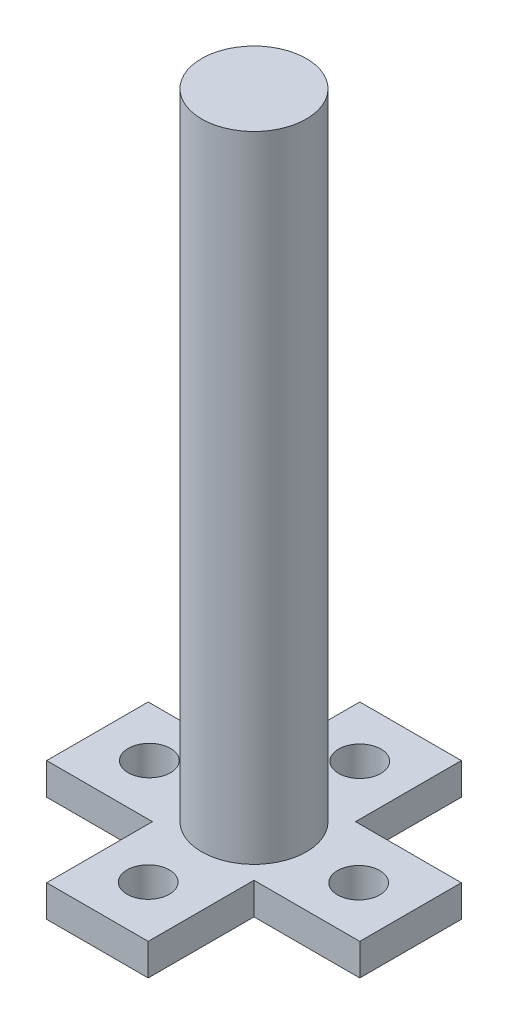
ISO-10303-21;
HEADER;
FILE_DESCRIPTION(('STEP AP214'),'2;1');
FILE_NAME('part.step','',(''),(''),'','','');
FILE_SCHEMA(('AUTOMOTIVE_DESIGN { 1 0 10303 214 1 1 1 1 }'));
ENDSEC;
DATA;
#1=APPLICATION_CONTEXT('core data for automotive mechanical design processes');
#2=APPLICATION_PROTOCOL_DEFINITION('international standard','automotive_design',2000,#1);
#3=PRODUCT_CONTEXT('',#1,'mechanical');
#4=PRODUCT('Part','Part','',(#3));
#5=PRODUCT_RELATED_PRODUCT_CATEGORY('part','',(#4));
#6=PRODUCT_DEFINITION_FORMATION('','',#4);
#7=PRODUCT_DEFINITION_CONTEXT('part definition',#1,'design');
#8=PRODUCT_DEFINITION('design','',#6,#7);
#9=PRODUCT_DEFINITION_SHAPE('','',#8);
#10=(LENGTH_UNIT() NAMED_UNIT(*) SI_UNIT(.MILLI.,.METRE.));
#11=(NAMED_UNIT(*) PLANE_ANGLE_UNIT() SI_UNIT($,.RADIAN.));
#12=(NAMED_UNIT(*) SI_UNIT($,.STERADIAN.) SOLID_ANGLE_UNIT());
#13=UNCERTAINTY_MEASURE_WITH_UNIT(LENGTH_MEASURE(1.E-05),#10,'distance_accuracy_value','');
#14=(GEOMETRIC_REPRESENTATION_CONTEXT(3) GLOBAL_UNCERTAINTY_ASSIGNED_CONTEXT((#13)) GLOBAL_UNIT_ASSIGNED_CONTEXT((#10,
#11,#12)) REPRESENTATION_CONTEXT('',''));
#15=CARTESIAN_POINT('',(0.,0.,0.));
#16=DIRECTION('',(0.,0.,1.));
#17=DIRECTION('',(1.,0.,0.));
#18=AXIS2_PLACEMENT_3D('',#15,#16,#17);
#19=CARTESIAN_POINT('',(-14.8,3.,0.));
#20=DIRECTION('',(-1.,0.,0.));
#21=DIRECTION('',(0.,0.,1.));
#22=AXIS2_PLACEMENT_3D('',#19,#20,#21);
#23=PLANE('',#22);
#24=DIRECTION('',(0.,0.,-1.));
#25=VECTOR('',#24,1.);
#26=CARTESIAN_POINT('',(-14.8,0.,0.));
#27=LINE('',#26,#25);
#28=CARTESIAN_POINT('',(-14.8,0.,4.8));
#29=VERTEX_POINT('',#28);
#30=CARTESIAN_POINT('',(-14.8,0.,-4.8));
#31=VERTEX_POINT('',#30);
#32=EDGE_CURVE('E189',#29,#31,#27,.T.);
#33=ORIENTED_EDGE('',*,*,#32,.F.);
#34=DIRECTION('',(0.,-1.,0.));
#35=VECTOR('',#34,1.);
#36=CARTESIAN_POINT('',(-14.8,3.,4.8));
#37=LINE('',#36,#35);
#38=CARTESIAN_POINT('',(-14.8,3.,4.8));
#39=VERTEX_POINT('',#38);
#40=EDGE_CURVE('E57',#39,#29,#37,.T.);
#41=ORIENTED_EDGE('',*,*,#40,.F.);
#42=DIRECTION('',(0.,0.,-1.));
#43=VECTOR('',#42,1.);
#44=CARTESIAN_POINT('',(-14.8,3.,0.));
#45=LINE('',#44,#43);
#46=CARTESIAN_POINT('',(-14.8,3.,-4.8));
#47=VERTEX_POINT('',#46);
#48=EDGE_CURVE('E365',#39,#47,#45,.T.);
#49=ORIENTED_EDGE('',*,*,#48,.T.);
#50=DIRECTION('',(0.,-1.,0.));
#51=VECTOR('',#50,1.);
#52=CARTESIAN_POINT('',(-14.8,3.,-4.8));
#53=LINE('',#52,#51);
#54=EDGE_CURVE('E65',#47,#31,#53,.T.);
#55=ORIENTED_EDGE('',*,*,#54,.T.);
#56=EDGE_LOOP('',(#33,#41,#49,#55));
#57=FACE_BOUND('',#56,.T.);
#58=ADVANCED_FACE('F47',(#57),#23,.T.);
#59=CARTESIAN_POINT('',(0.,3.,4.8));
#60=DIRECTION('',(0.,0.,-1.));
#61=DIRECTION('',(-1.,0.,0.));
#62=AXIS2_PLACEMENT_3D('',#59,#60,#61);
#63=PLANE('',#62);
#64=DIRECTION('',(1.,0.,0.));
#65=VECTOR('',#64,1.);
#66=CARTESIAN_POINT('',(0.,0.,4.8));
#67=LINE('',#66,#65);
#68=CARTESIAN_POINT('',(-4.80000000000001,0.,4.8));
#69=VERTEX_POINT('',#68);
#70=EDGE_CURVE('E193',#29,#69,#67,.T.);
#71=ORIENTED_EDGE('',*,*,#70,.T.);
#72=DIRECTION('',(0.,-1.,0.));
#73=VECTOR('',#72,1.);
#74=CARTESIAN_POINT('',(-4.80000000000001,3.,4.8));
#75=LINE('',#74,#73);
#76=CARTESIAN_POINT('',(-4.80000000000001,3.,4.8));
#77=VERTEX_POINT('',#76);
#78=EDGE_CURVE('E274',#77,#69,#75,.T.);
#79=ORIENTED_EDGE('',*,*,#78,.F.);
#80=DIRECTION('',(1.,0.,0.));
#81=VECTOR('',#80,1.);
#82=CARTESIAN_POINT('',(0.,3.,4.8));
#83=LINE('',#82,#81);
#84=EDGE_CURVE('E281',#39,#77,#83,.T.);
#85=ORIENTED_EDGE('',*,*,#84,.F.);
#86=ORIENTED_EDGE('',*,*,#40,.T.);
#87=EDGE_LOOP('',(#71,#79,#85,#86));
#88=FACE_BOUND('',#87,.T.);
#89=ADVANCED_FACE('F279',(#88),#63,.F.);
#90=CARTESIAN_POINT('',(-4.80000000000001,3.,0.));
#91=DIRECTION('',(-1.,0.,0.));
#92=DIRECTION('',(0.,0.,1.));
#93=AXIS2_PLACEMENT_3D('',#90,#91,#92);
#94=PLANE('',#93);
#95=DIRECTION('',(0.,0.,-1.));
#96=VECTOR('',#95,1.);
#97=CARTESIAN_POINT('',(-4.80000000000001,0.,0.));
#98=LINE('',#97,#96);
#99=CARTESIAN_POINT('',(-4.80000000000001,0.,14.8));
#100=VERTEX_POINT('',#99);
#101=EDGE_CURVE('E197',#100,#69,#98,.T.);
#102=ORIENTED_EDGE('',*,*,#101,.F.);
#103=DIRECTION('',(0.,-1.,0.));
#104=VECTOR('',#103,1.);
#105=CARTESIAN_POINT('',(-4.80000000000001,3.,14.8));
#106=LINE('',#105,#104);
#107=CARTESIAN_POINT('',(-4.80000000000001,3.,14.8));
#108=VERTEX_POINT('',#107);
#109=EDGE_CURVE('E271',#108,#100,#106,.T.);
#110=ORIENTED_EDGE('',*,*,#109,.F.);
#111=DIRECTION('',(0.,0.,-1.));
#112=VECTOR('',#111,1.);
#113=CARTESIAN_POINT('',(-4.80000000000001,3.,0.));
#114=LINE('',#113,#112);
#115=EDGE_CURVE('E370',#108,#77,#114,.T.);
#116=ORIENTED_EDGE('',*,*,#115,.T.);
#117=ORIENTED_EDGE('',*,*,#78,.T.);
#118=EDGE_LOOP('',(#102,#110,#116,#117));
#119=FACE_BOUND('',#118,.T.);
#120=ADVANCED_FACE('F291',(#119),#94,.T.);
#121=CARTESIAN_POINT('',(0.,3.,14.8));
#122=DIRECTION('',(0.,0.,-1.));
#123=DIRECTION('',(-1.,0.,0.));
#124=AXIS2_PLACEMENT_3D('',#121,#122,#123);
#125=PLANE('',#124);
#126=DIRECTION('',(1.,0.,0.));
#127=VECTOR('',#126,1.);
#128=CARTESIAN_POINT('',(0.,0.,14.8));
#129=LINE('',#128,#127);
#130=CARTESIAN_POINT('',(4.79999999999999,0.,14.8));
#131=VERTEX_POINT('',#130);
#132=EDGE_CURVE('E201',#100,#131,#129,.T.);
#133=ORIENTED_EDGE('',*,*,#132,.T.);
#134=DIRECTION('',(0.,-1.,0.));
#135=VECTOR('',#134,1.);
#136=CARTESIAN_POINT('',(4.79999999999999,3.,14.8));
#137=LINE('',#136,#135);
#138=CARTESIAN_POINT('',(4.79999999999999,3.,14.8));
#139=VERTEX_POINT('',#138);
#140=EDGE_CURVE('E267',#139,#131,#137,.T.);
#141=ORIENTED_EDGE('',*,*,#140,.F.);
#142=DIRECTION('',(1.,0.,0.));
#143=VECTOR('',#142,1.);
#144=CARTESIAN_POINT('',(0.,3.,14.8));
#145=LINE('',#144,#143);
#146=EDGE_CURVE('E374',#108,#139,#145,.T.);
#147=ORIENTED_EDGE('',*,*,#146,.F.);
#148=ORIENTED_EDGE('',*,*,#109,.T.);
#149=EDGE_LOOP('',(#133,#141,#147,#148));
#150=FACE_BOUND('',#149,.T.);
#151=ADVANCED_FACE('F296',(#150),#125,.F.);
#152=CARTESIAN_POINT('',(4.79999999999999,3.,0.));
#153=DIRECTION('',(-1.,0.,0.));
#154=DIRECTION('',(0.,0.,1.));
#155=AXIS2_PLACEMENT_3D('',#152,#153,#154);
#156=PLANE('',#155);
#157=DIRECTION('',(0.,0.,-1.));
#158=VECTOR('',#157,1.);
#159=CARTESIAN_POINT('',(4.79999999999999,0.,0.));
#160=LINE('',#159,#158);
#161=CARTESIAN_POINT('',(4.79999999999999,0.,4.8));
#162=VERTEX_POINT('',#161);
#163=EDGE_CURVE('E205',#131,#162,#160,.T.);
#164=ORIENTED_EDGE('',*,*,#163,.T.);
#165=DIRECTION('',(0.,-1.,0.));
#166=VECTOR('',#165,1.);
#167=CARTESIAN_POINT('',(4.79999999999999,3.,4.8));
#168=LINE('',#167,#166);
#169=CARTESIAN_POINT('',(4.79999999999999,3.,4.8));
#170=VERTEX_POINT('',#169);
#171=EDGE_CURVE('E263',#170,#162,#168,.T.);
#172=ORIENTED_EDGE('',*,*,#171,.F.);
#173=DIRECTION('',(0.,0.,-1.));
#174=VECTOR('',#173,1.);
#175=CARTESIAN_POINT('',(4.79999999999999,3.,0.));
#176=LINE('',#175,#174);
#177=EDGE_CURVE('E378',#139,#170,#176,.T.);
#178=ORIENTED_EDGE('',*,*,#177,.F.);
#179=ORIENTED_EDGE('',*,*,#140,.T.);
#180=EDGE_LOOP('',(#164,#172,#178,#179));
#181=FACE_BOUND('',#180,.T.);
#182=ADVANCED_FACE('F300',(#181),#156,.F.);
#183=CARTESIAN_POINT('',(0.,3.,4.8));
#184=DIRECTION('',(0.,0.,-1.));
#185=DIRECTION('',(-1.,0.,0.));
#186=AXIS2_PLACEMENT_3D('',#183,#184,#185);
#187=PLANE('',#186);
#188=DIRECTION('',(1.,0.,0.));
#189=VECTOR('',#188,1.);
#190=CARTESIAN_POINT('',(0.,0.,4.8));
#191=LINE('',#190,#189);
#192=CARTESIAN_POINT('',(14.8,0.,4.8));
#193=VERTEX_POINT('',#192);
#194=EDGE_CURVE('E209',#162,#193,#191,.T.);
#195=ORIENTED_EDGE('',*,*,#194,.T.);
#196=DIRECTION('',(0.,-1.,0.));
#197=VECTOR('',#196,1.);
#198=CARTESIAN_POINT('',(14.8,3.,4.8));
#199=LINE('',#198,#197);
#200=CARTESIAN_POINT('',(14.8,3.,4.8));
#201=VERTEX_POINT('',#200);
#202=EDGE_CURVE('E259',#201,#193,#199,.T.);
#203=ORIENTED_EDGE('',*,*,#202,.F.);
#204=DIRECTION('',(1.,0.,0.));
#205=VECTOR('',#204,1.);
#206=CARTESIAN_POINT('',(0.,3.,4.8));
#207=LINE('',#206,#205);
#208=EDGE_CURVE('E382',#170,#201,#207,.T.);
#209=ORIENTED_EDGE('',*,*,#208,.F.);
#210=ORIENTED_EDGE('',*,*,#171,.T.);
#211=EDGE_LOOP('',(#195,#203,#209,#210));
#212=FACE_BOUND('',#211,.T.);
#213=ADVANCED_FACE('F304',(#212),#187,.F.);
#214=CARTESIAN_POINT('',(14.8,3.,0.));
#215=DIRECTION('',(-1.,0.,0.));
#216=DIRECTION('',(0.,0.,1.));
#217=AXIS2_PLACEMENT_3D('',#214,#215,#216);
#218=PLANE('',#217);
#219=DIRECTION('',(0.,0.,-1.));
#220=VECTOR('',#219,1.);
#221=CARTESIAN_POINT('',(14.8,0.,0.));
#222=LINE('',#221,#220);
#223=CARTESIAN_POINT('',(14.8,0.,-4.8));
#224=VERTEX_POINT('',#223);
#225=EDGE_CURVE('E213',#193,#224,#222,.T.);
#226=ORIENTED_EDGE('',*,*,#225,.T.);
#227=DIRECTION('',(0.,-1.,0.));
#228=VECTOR('',#227,1.);
#229=CARTESIAN_POINT('',(14.8,3.,-4.8));
#230=LINE('',#229,#228);
#231=CARTESIAN_POINT('',(14.8,3.,-4.8));
#232=VERTEX_POINT('',#231);
#233=EDGE_CURVE('E256',#232,#224,#230,.T.);
#234=ORIENTED_EDGE('',*,*,#233,.F.);
#235=DIRECTION('',(0.,0.,-1.));
#236=VECTOR('',#235,1.);
#237=CARTESIAN_POINT('',(14.8,3.,0.));
#238=LINE('',#237,#236);
#239=EDGE_CURVE('E386',#201,#232,#238,.T.);
#240=ORIENTED_EDGE('',*,*,#239,.F.);
#241=ORIENTED_EDGE('',*,*,#202,.T.);
#242=EDGE_LOOP('',(#226,#234,#240,#241));
#243=FACE_BOUND('',#242,.T.);
#244=ADVANCED_FACE('F308',(#243),#218,.F.);
#245=CARTESIAN_POINT('',(0.,3.,-4.8));
#246=DIRECTION('',(0.,0.,-1.));
#247=DIRECTION('',(-1.,0.,0.));
#248=AXIS2_PLACEMENT_3D('',#245,#246,#247);
#249=PLANE('',#248);
#250=DIRECTION('',(1.,0.,0.));
#251=VECTOR('',#250,1.);
#252=CARTESIAN_POINT('',(0.,0.,-4.8));
#253=LINE('',#252,#251);
#254=CARTESIAN_POINT('',(4.79999999999999,0.,-4.8));
#255=VERTEX_POINT('',#254);
#256=EDGE_CURVE('E217',#255,#224,#253,.T.);
#257=ORIENTED_EDGE('',*,*,#256,.F.);
#258=DIRECTION('',(0.,-1.,0.));
#259=VECTOR('',#258,1.);
#260=CARTESIAN_POINT('',(4.79999999999999,3.,-4.8));
#261=LINE('',#260,#259);
#262=CARTESIAN_POINT('',(4.79999999999999,3.,-4.8));
#263=VERTEX_POINT('',#262);
#264=EDGE_CURVE('E253',#263,#255,#261,.T.);
#265=ORIENTED_EDGE('',*,*,#264,.F.);
#266=DIRECTION('',(1.,0.,0.));
#267=VECTOR('',#266,1.);
#268=CARTESIAN_POINT('',(0.,3.,-4.8));
#269=LINE('',#268,#267);
#270=EDGE_CURVE('E389',#263,#232,#269,.T.);
#271=ORIENTED_EDGE('',*,*,#270,.T.);
#272=ORIENTED_EDGE('',*,*,#233,.T.);
#273=EDGE_LOOP('',(#257,#265,#271,#272));
#274=FACE_BOUND('',#273,.T.);
#275=ADVANCED_FACE('F312',(#274),#249,.T.);
#276=CARTESIAN_POINT('',(4.79999999999999,3.,0.));
#277=DIRECTION('',(-1.,0.,0.));
#278=DIRECTION('',(0.,0.,1.));
#279=AXIS2_PLACEMENT_3D('',#276,#277,#278);
#280=PLANE('',#279);
#281=DIRECTION('',(0.,0.,-1.));
#282=VECTOR('',#281,1.);
#283=CARTESIAN_POINT('',(4.79999999999999,0.,0.));
#284=LINE('',#283,#282);
#285=CARTESIAN_POINT('',(4.79999999999999,0.,-14.8));
#286=VERTEX_POINT('',#285);
#287=EDGE_CURVE('E221',#255,#286,#284,.T.);
#288=ORIENTED_EDGE('',*,*,#287,.T.);
#289=DIRECTION('',(0.,-1.,0.));
#290=VECTOR('',#289,1.);
#291=CARTESIAN_POINT('',(4.79999999999999,3.,-14.8));
#292=LINE('',#291,#290);
#293=CARTESIAN_POINT('',(4.79999999999999,3.,-14.8));
#294=VERTEX_POINT('',#293);
#295=EDGE_CURVE('E150',#294,#286,#292,.T.);
#296=ORIENTED_EDGE('',*,*,#295,.F.);
#297=DIRECTION('',(0.,0.,-1.));
#298=VECTOR('',#297,1.);
#299=CARTESIAN_POINT('',(4.79999999999999,3.,0.));
#300=LINE('',#299,#298);
#301=EDGE_CURVE('E161',#263,#294,#300,.T.);
#302=ORIENTED_EDGE('',*,*,#301,.F.);
#303=ORIENTED_EDGE('',*,*,#264,.T.);
#304=EDGE_LOOP('',(#288,#296,#302,#303));
#305=FACE_BOUND('',#304,.T.);
#306=ADVANCED_FACE('F316',(#305),#280,.F.);
#307=CARTESIAN_POINT('',(0.,3.,-14.8));
#308=DIRECTION('',(0.,0.,-1.));
#309=DIRECTION('',(-1.,0.,0.));
#310=AXIS2_PLACEMENT_3D('',#307,#308,#309);
#311=PLANE('',#310);
#312=DIRECTION('',(1.,0.,0.));
#313=VECTOR('',#312,1.);
#314=CARTESIAN_POINT('',(0.,0.,-14.8));
#315=LINE('',#314,#313);
#316=CARTESIAN_POINT('',(-4.80000000000001,0.,-14.8));
#317=VERTEX_POINT('',#316);
#318=EDGE_CURVE('E145',#317,#286,#315,.T.);
#319=ORIENTED_EDGE('',*,*,#318,.F.);
#320=DIRECTION('',(0.,-1.,0.));
#321=VECTOR('',#320,1.);
#322=CARTESIAN_POINT('',(-4.80000000000001,3.,-14.8));
#323=LINE('',#322,#321);
#324=CARTESIAN_POINT('',(-4.80000000000001,3.,-14.8));
#325=VERTEX_POINT('',#324);
#326=EDGE_CURVE('E140',#325,#317,#323,.T.);
#327=ORIENTED_EDGE('',*,*,#326,.F.);
#328=DIRECTION('',(1.,0.,0.));
#329=VECTOR('',#328,1.);
#330=CARTESIAN_POINT('',(0.,3.,-14.8));
#331=LINE('',#330,#329);
#332=EDGE_CURVE('E143',#325,#294,#331,.T.);
#333=ORIENTED_EDGE('',*,*,#332,.T.);
#334=ORIENTED_EDGE('',*,*,#295,.T.);
#335=EDGE_LOOP('',(#319,#327,#333,#334));
#336=FACE_BOUND('',#335,.T.);
#337=ADVANCED_FACE('F142',(#336),#311,.T.);
#338=CARTESIAN_POINT('',(-4.80000000000001,3.,0.));
#339=DIRECTION('',(-1.,0.,0.));
#340=DIRECTION('',(0.,0.,1.));
#341=AXIS2_PLACEMENT_3D('',#338,#339,#340);
#342=PLANE('',#341);
#343=DIRECTION('',(0.,0.,-1.));
#344=VECTOR('',#343,1.);
#345=CARTESIAN_POINT('',(-4.80000000000001,0.,0.));
#346=LINE('',#345,#344);
#347=CARTESIAN_POINT('',(-4.80000000000001,0.,-4.8));
#348=VERTEX_POINT('',#347);
#349=EDGE_CURVE('E227',#348,#317,#346,.T.);
#350=ORIENTED_EDGE('',*,*,#349,.F.);
#351=DIRECTION('',(0.,-1.,0.));
#352=VECTOR('',#351,1.);
#353=CARTESIAN_POINT('',(-4.80000000000001,3.,-4.8));
#354=LINE('',#353,#352);
#355=CARTESIAN_POINT('',(-4.80000000000001,3.,-4.8));
#356=VERTEX_POINT('',#355);
#357=EDGE_CURVE('E103',#356,#348,#354,.T.);
#358=ORIENTED_EDGE('',*,*,#357,.F.);
#359=DIRECTION('',(0.,0.,-1.));
#360=VECTOR('',#359,1.);
#361=CARTESIAN_POINT('',(-4.80000000000001,3.,0.));
#362=LINE('',#361,#360);
#363=EDGE_CURVE('E158',#356,#325,#362,.T.);
#364=ORIENTED_EDGE('',*,*,#363,.T.);
#365=ORIENTED_EDGE('',*,*,#326,.T.);
#366=EDGE_LOOP('',(#350,#358,#364,#365));
#367=FACE_BOUND('',#366,.T.);
#368=ADVANCED_FACE('F165',(#367),#342,.T.);
#369=CARTESIAN_POINT('',(9.94644047395354,3.,0.0535595260516415));
#370=DIRECTION('',(0.,-1.,0.));
#371=DIRECTION('',(0.,0.,-1.));
#372=AXIS2_PLACEMENT_3D('',#369,#370,#371);
#373=CYLINDRICAL_SURFACE('',#372,2.);
#374=CARTESIAN_POINT('',(9.94644047395354,3.,0.0535595260516415));
#375=DIRECTION('',(0.,1.,0.));
#376=DIRECTION('',(0.,0.,1.));
#377=AXIS2_PLACEMENT_3D('',#374,#375,#376);
#378=CIRCLE('',#377,2.);
#379=CARTESIAN_POINT('',(9.94644047395354,3.,2.05355952605164));
#380=VERTEX_POINT('',#379);
#381=EDGE_CURVE('E177',#380,#380,#378,.T.);
#382=ORIENTED_EDGE('',*,*,#381,.T.);
#383=EDGE_LOOP('',(#382));
#384=FACE_BOUND('',#383,.T.);
#385=CARTESIAN_POINT('',(9.94644047395354,0.,0.0535595260516415));
#386=DIRECTION('',(0.,1.,0.));
#387=DIRECTION('',(0.,0.,1.));
#388=AXIS2_PLACEMENT_3D('',#385,#386,#387);
#389=CIRCLE('',#388,2.);
#390=CARTESIAN_POINT('',(9.94644047395354,0.,2.05355952605164));
#391=VERTEX_POINT('',#390);
#392=EDGE_CURVE('E238',#391,#391,#389,.T.);
#393=ORIENTED_EDGE('',*,*,#392,.F.);
#394=EDGE_LOOP('',(#393));
#395=FACE_BOUND('',#394,.T.);
#396=ADVANCED_FACE('F325',(#384,#395),#373,.F.);
#397=CARTESIAN_POINT('',(0.0535595260516067,3.,-9.94644047395354));
#398=DIRECTION('',(0.,-1.,0.));
#399=DIRECTION('',(0.,0.,-1.));
#400=AXIS2_PLACEMENT_3D('',#397,#398,#399);
#401=CYLINDRICAL_SURFACE('',#400,2.);
#402=CARTESIAN_POINT('',(0.0535595260516067,3.,-9.94644047395354));
#403=DIRECTION('',(0.,1.,0.));
#404=DIRECTION('',(0.,0.,1.));
#405=AXIS2_PLACEMENT_3D('',#402,#403,#404);
#406=CIRCLE('',#405,2.);
#407=CARTESIAN_POINT('',(0.0535595260516067,3.,-7.94644047395355));
#408=VERTEX_POINT('',#407);
#409=EDGE_CURVE('E170',#408,#408,#406,.T.);
#410=ORIENTED_EDGE('',*,*,#409,.T.);
#411=EDGE_LOOP('',(#410));
#412=FACE_BOUND('',#411,.T.);
#413=CARTESIAN_POINT('',(0.0535595260516067,0.,-9.94644047395354));
#414=DIRECTION('',(0.,1.,0.));
#415=DIRECTION('',(0.,0.,1.));
#416=AXIS2_PLACEMENT_3D('',#413,#414,#415);
#417=CIRCLE('',#416,2.);
#418=CARTESIAN_POINT('',(0.0535595260516067,0.,-7.94644047395355));
#419=VERTEX_POINT('',#418);
#420=EDGE_CURVE('E234',#419,#419,#417,.T.);
#421=ORIENTED_EDGE('',*,*,#420,.F.);
#422=EDGE_LOOP('',(#421));
#423=FACE_BOUND('',#422,.T.);
#424=ADVANCED_FACE('F329',(#412,#423),#401,.F.);
#425=CARTESIAN_POINT('',(0.,3.,-4.8));
#426=DIRECTION('',(0.,0.,-1.));
#427=DIRECTION('',(-1.,0.,0.));
#428=AXIS2_PLACEMENT_3D('',#425,#426,#427);
#429=PLANE('',#428);
#430=DIRECTION('',(1.,0.,0.));
#431=VECTOR('',#430,1.);
#432=CARTESIAN_POINT('',(0.,0.,-4.8));
#433=LINE('',#432,#431);
#434=EDGE_CURVE('E230',#31,#348,#433,.T.);
#435=ORIENTED_EDGE('',*,*,#434,.F.);
#436=ORIENTED_EDGE('',*,*,#54,.F.);
#437=DIRECTION('',(1.,0.,0.));
#438=VECTOR('',#437,1.);
#439=CARTESIAN_POINT('',(0.,3.,-4.8));
#440=LINE('',#439,#438);
#441=EDGE_CURVE('E167',#47,#356,#440,.T.);
#442=ORIENTED_EDGE('',*,*,#441,.T.);
#443=ORIENTED_EDGE('',*,*,#357,.T.);
#444=EDGE_LOOP('',(#435,#436,#442,#443));
#445=FACE_BOUND('',#444,.T.);
#446=ADVANCED_FACE('F326',(#445),#429,.T.);
#447=CARTESIAN_POINT('',(-9.94644047395354,3.,-0.053559526051572));
#448=DIRECTION('',(0.,-1.,0.));
#449=DIRECTION('',(0.,0.,-1.));
#450=AXIS2_PLACEMENT_3D('',#447,#448,#449);
#451=CYLINDRICAL_SURFACE('',#450,2.);
#452=CARTESIAN_POINT('',(-9.94644047395354,3.,-0.053559526051572));
#453=DIRECTION('',(0.,1.,0.));
#454=DIRECTION('',(0.,0.,1.));
#455=AXIS2_PLACEMENT_3D('',#452,#453,#454);
#456=CIRCLE('',#455,2.);
#457=CARTESIAN_POINT('',(-9.94644047395354,3.,1.94644047394843));
#458=VERTEX_POINT('',#457);
#459=EDGE_CURVE('E246',#458,#458,#456,.T.);
#460=ORIENTED_EDGE('',*,*,#459,.T.);
#461=EDGE_LOOP('',(#460));
#462=FACE_BOUND('',#461,.T.);
#463=CARTESIAN_POINT('',(-9.94644047395354,0.,-0.053559526051572));
#464=DIRECTION('',(0.,1.,0.));
#465=DIRECTION('',(0.,0.,1.));
#466=AXIS2_PLACEMENT_3D('',#463,#464,#465);
#467=CIRCLE('',#466,2.);
#468=CARTESIAN_POINT('',(-9.94644047395354,0.,1.94644047394843));
#469=VERTEX_POINT('',#468);
#470=EDGE_CURVE('E185',#469,#469,#467,.T.);
#471=ORIENTED_EDGE('',*,*,#470,.F.);
#472=EDGE_LOOP('',(#471));
#473=FACE_BOUND('',#472,.T.);
#474=ADVANCED_FACE('F49',(#462,#473),#451,.F.);
#475=CARTESIAN_POINT('',(-0.0535595260516762,3.,9.94644047395354));
#476=DIRECTION('',(0.,-1.,0.));
#477=DIRECTION('',(0.,0.,-1.));
#478=AXIS2_PLACEMENT_3D('',#475,#476,#477);
#479=CYLINDRICAL_SURFACE('',#478,2.);
#480=CARTESIAN_POINT('',(-0.0535595260516762,3.,9.94644047395354));
#481=DIRECTION('',(0.,1.,0.));
#482=DIRECTION('',(0.,0.,1.));
#483=AXIS2_PLACEMENT_3D('',#480,#481,#482);
#484=CIRCLE('',#483,2.);
#485=CARTESIAN_POINT('',(-0.0535595260516762,3.,11.9464404739535));
#486=VERTEX_POINT('',#485);
#487=EDGE_CURVE('E181',#486,#486,#484,.T.);
#488=ORIENTED_EDGE('',*,*,#487,.T.);
#489=EDGE_LOOP('',(#488));
#490=FACE_BOUND('',#489,.T.);
#491=CARTESIAN_POINT('',(-0.0535595260516762,0.,9.94644047395354));
#492=DIRECTION('',(0.,1.,0.));
#493=DIRECTION('',(0.,0.,1.));
#494=AXIS2_PLACEMENT_3D('',#491,#492,#493);
#495=CIRCLE('',#494,2.);
#496=CARTESIAN_POINT('',(-0.0535595260516762,0.,11.9464404739535));
#497=VERTEX_POINT('',#496);
#498=EDGE_CURVE('E242',#497,#497,#495,.T.);
#499=ORIENTED_EDGE('',*,*,#498,.F.);
#500=EDGE_LOOP('',(#499));
#501=FACE_BOUND('',#500,.T.);
#502=ADVANCED_FACE('F336',(#490,#501),#479,.F.);
#503=CARTESIAN_POINT('',(0.,3.,0.));
#504=DIRECTION('',(0.,1.,0.));
#505=DIRECTION('',(0.,0.,1.));
#506=AXIS2_PLACEMENT_3D('',#503,#504,#505);
#507=PLANE('',#506);
#508=CARTESIAN_POINT('',(0.,3.,0.));
#509=DIRECTION('',(0.,1.,0.));
#510=DIRECTION('',(0.,0.,1.));
#511=AXIS2_PLACEMENT_3D('',#508,#509,#510);
#512=CIRCLE('',#511,4.95);
#513=CARTESIAN_POINT('',(0.,3.,4.95));
#514=VERTEX_POINT('',#513);
#515=EDGE_CURVE('E11',#514,#514,#512,.T.);
#516=ORIENTED_EDGE('',*,*,#515,.F.);
#517=EDGE_LOOP('',(#516));
#518=FACE_BOUND('',#517,.T.);
#519=ORIENTED_EDGE('',*,*,#459,.F.);
#520=EDGE_LOOP('',(#519));
#521=FACE_BOUND('',#520,.T.);
#522=ORIENTED_EDGE('',*,*,#48,.F.);
#523=ORIENTED_EDGE('',*,*,#84,.T.);
#524=ORIENTED_EDGE('',*,*,#115,.F.);
#525=ORIENTED_EDGE('',*,*,#146,.T.);
#526=ORIENTED_EDGE('',*,*,#177,.T.);
#527=ORIENTED_EDGE('',*,*,#208,.T.);
#528=ORIENTED_EDGE('',*,*,#239,.T.);
#529=ORIENTED_EDGE('',*,*,#270,.F.);
#530=ORIENTED_EDGE('',*,*,#301,.T.);
#531=ORIENTED_EDGE('',*,*,#332,.F.);
#532=ORIENTED_EDGE('',*,*,#363,.F.);
#533=ORIENTED_EDGE('',*,*,#441,.F.);
#534=EDGE_LOOP('',(#522,#523,#524,#525,#526,#527,#528,#529,#530,#531,#532,#533));
#535=FACE_BOUND('',#534,.T.);
#536=ORIENTED_EDGE('',*,*,#409,.F.);
#537=EDGE_LOOP('',(#536));
#538=FACE_BOUND('',#537,.T.);
#539=ORIENTED_EDGE('',*,*,#381,.F.);
#540=EDGE_LOOP('',(#539));
#541=FACE_BOUND('',#540,.T.);
#542=ORIENTED_EDGE('',*,*,#487,.F.);
#543=EDGE_LOOP('',(#542));
#544=FACE_BOUND('',#543,.T.);
#545=ADVANCED_FACE('F155',(#518,#521,#535,#538,#541,#544),#507,.T.);
#546=CARTESIAN_POINT('',(0.,0.,0.));
#547=DIRECTION('',(0.,1.,0.));
#548=DIRECTION('',(0.,0.,1.));
#549=AXIS2_PLACEMENT_3D('',#546,#547,#548);
#550=PLANE('',#549);
#551=ORIENTED_EDGE('',*,*,#470,.T.);
#552=EDGE_LOOP('',(#551));
#553=FACE_BOUND('',#552,.T.);
#554=ORIENTED_EDGE('',*,*,#32,.T.);
#555=ORIENTED_EDGE('',*,*,#434,.T.);
#556=ORIENTED_EDGE('',*,*,#349,.T.);
#557=ORIENTED_EDGE('',*,*,#318,.T.);
#558=ORIENTED_EDGE('',*,*,#287,.F.);
#559=ORIENTED_EDGE('',*,*,#256,.T.);
#560=ORIENTED_EDGE('',*,*,#225,.F.);
#561=ORIENTED_EDGE('',*,*,#194,.F.);
#562=ORIENTED_EDGE('',*,*,#163,.F.);
#563=ORIENTED_EDGE('',*,*,#132,.F.);
#564=ORIENTED_EDGE('',*,*,#101,.T.);
#565=ORIENTED_EDGE('',*,*,#70,.F.);
#566=EDGE_LOOP('',(#554,#555,#556,#557,#558,#559,#560,#561,#562,#563,#564,#565));
#567=FACE_BOUND('',#566,.T.);
#568=ORIENTED_EDGE('',*,*,#420,.T.);
#569=EDGE_LOOP('',(#568));
#570=FACE_BOUND('',#569,.T.);
#571=ORIENTED_EDGE('',*,*,#392,.T.);
#572=EDGE_LOOP('',(#571));
#573=FACE_BOUND('',#572,.T.);
#574=ORIENTED_EDGE('',*,*,#498,.T.);
#575=EDGE_LOOP('',(#574));
#576=FACE_BOUND('',#575,.T.);
#577=ADVANCED_FACE('F283',(#553,#567,#570,#573,#576),#550,.F.);
#578=CARTESIAN_POINT('',(0.,3.,0.));
#579=DIRECTION('',(0.,1.,0.));
#580=DIRECTION('',(0.,0.,1.));
#581=AXIS2_PLACEMENT_3D('',#578,#579,#580);
#582=CYLINDRICAL_SURFACE('',#581,4.95);
#583=ORIENTED_EDGE('',*,*,#515,.T.);
#584=EDGE_LOOP('',(#583));
#585=FACE_BOUND('',#584,.T.);
#586=CARTESIAN_POINT('',(0.,63.,0.));
#587=DIRECTION('',(0.,1.,0.));
#588=DIRECTION('',(0.,0.,1.));
#589=AXIS2_PLACEMENT_3D('',#586,#587,#588);
#590=CIRCLE('',#589,4.95);
#591=CARTESIAN_POINT('',(0.,63.,4.95));
#592=VERTEX_POINT('',#591);
#593=EDGE_CURVE('E190',#592,#592,#590,.T.);
#594=ORIENTED_EDGE('',*,*,#593,.F.);
#595=EDGE_LOOP('',(#594));
#596=FACE_BOUND('',#595,.T.);
#597=ADVANCED_FACE('F342',(#585,#596),#582,.T.);
#598=CARTESIAN_POINT('',(0.,63.,0.));
#599=DIRECTION('',(0.,1.,0.));
#600=DIRECTION('',(0.,0.,1.));
#601=AXIS2_PLACEMENT_3D('',#598,#599,#600);
#602=PLANE('',#601);
#603=ORIENTED_EDGE('',*,*,#593,.T.);
#604=EDGE_LOOP('',(#603));
#605=FACE_BOUND('',#604,.T.);
#606=ADVANCED_FACE('F347',(#605),#602,.T.);
#607=CLOSED_SHELL('',(#58,#89,#120,#151,#182,#213,#244,#275,#306,#337,#368,#396,#424,#446,#474,
#502,#545,#577,#597,#606));
#608=MANIFOLD_SOLID_BREP('B2',#607);
#609=ADVANCED_BREP_SHAPE_REPRESENTATION('',(#18,#608),#14);
#610=SHAPE_DEFINITION_REPRESENTATION(#9,#609);
ENDSEC;
END-ISO-10303-21;
